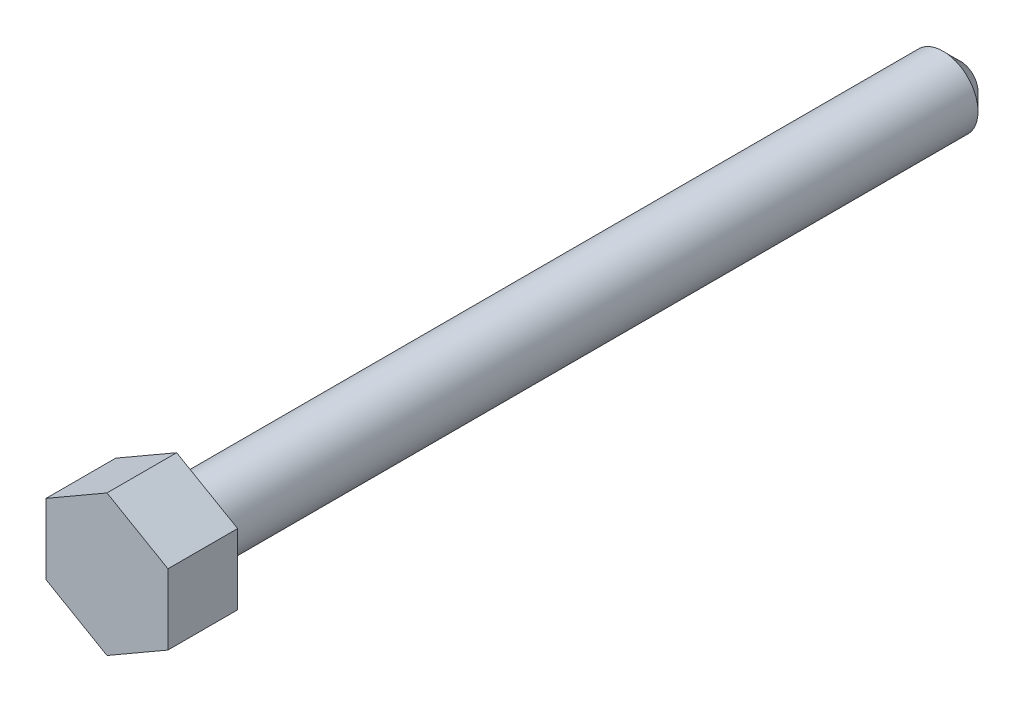
ISO-10303-21;
HEADER;
FILE_DESCRIPTION(('STEP AP214'),'2;1');
FILE_NAME('part.step','',(''),(''),'','','');
FILE_SCHEMA(('AUTOMOTIVE_DESIGN { 1 0 10303 214 1 1 1 1 }'));
ENDSEC;
DATA;
#1=APPLICATION_CONTEXT('core data for automotive mechanical design processes');
#2=APPLICATION_PROTOCOL_DEFINITION('international standard','automotive_design',2000,#1);
#3=PRODUCT_CONTEXT('',#1,'mechanical');
#4=PRODUCT('Part','Part','',(#3));
#5=PRODUCT_RELATED_PRODUCT_CATEGORY('part','',(#4));
#6=PRODUCT_DEFINITION_FORMATION('','',#4);
#7=PRODUCT_DEFINITION_CONTEXT('part definition',#1,'design');
#8=PRODUCT_DEFINITION('design','',#6,#7);
#9=PRODUCT_DEFINITION_SHAPE('','',#8);
#10=(LENGTH_UNIT() NAMED_UNIT(*) SI_UNIT(.MILLI.,.METRE.));
#11=(NAMED_UNIT(*) PLANE_ANGLE_UNIT() SI_UNIT($,.RADIAN.));
#12=(NAMED_UNIT(*) SI_UNIT($,.STERADIAN.) SOLID_ANGLE_UNIT());
#13=UNCERTAINTY_MEASURE_WITH_UNIT(LENGTH_MEASURE(1.E-05),#10,'distance_accuracy_value','');
#14=(GEOMETRIC_REPRESENTATION_CONTEXT(3) GLOBAL_UNCERTAINTY_ASSIGNED_CONTEXT((#13)) GLOBAL_UNIT_ASSIGNED_CONTEXT((#10,
#11,#12)) REPRESENTATION_CONTEXT('',''));
#15=CARTESIAN_POINT('',(0.,0.,0.));
#16=DIRECTION('',(0.,0.,1.));
#17=DIRECTION('',(1.,0.,0.));
#18=AXIS2_PLACEMENT_3D('',#15,#16,#17);
#19=CARTESIAN_POINT('',(0.,0.,45.));
#20=DIRECTION('',(0.,0.,-1.));
#21=DIRECTION('',(-1.,0.,0.));
#22=AXIS2_PLACEMENT_3D('',#19,#20,#21);
#23=CYLINDRICAL_SURFACE('',#22,2.);
#24=CARTESIAN_POINT('',(0.,0.,1.00000000000004));
#25=DIRECTION('',(0.,0.,1.));
#26=DIRECTION('',(1.,0.,0.));
#27=AXIS2_PLACEMENT_3D('',#24,#25,#26);
#28=CIRCLE('',#27,2.);
#29=CARTESIAN_POINT('',(-2.,0.,1.00000000000004));
#30=VERTEX_POINT('',#29);
#31=EDGE_CURVE('E42',#30,#30,#28,.T.);
#32=CARTESIAN_POINT('',(0.,0.,45.));
#33=DIRECTION('',(0.,0.,1.));
#34=DIRECTION('',(1.,0.,0.));
#35=AXIS2_PLACEMENT_3D('',#32,#33,#34);
#36=CIRCLE('',#35,2.);
#37=CARTESIAN_POINT('',(-2.,0.,45.));
#38=VERTEX_POINT('',#37);
#39=EDGE_CURVE('E138',#38,#38,#36,.T.);
#40=CARTESIAN_POINT('',(-2.,0.,1.00000000000004));
#41=CARTESIAN_POINT('',(-2.,0.,1.45833333333337));
#42=CARTESIAN_POINT('',(-2.,0.,1.9166666666667));
#43=CARTESIAN_POINT('',(-2.,0.,2.83333333333337));
#44=CARTESIAN_POINT('',(-2.,0.,3.2916666666667));
#45=CARTESIAN_POINT('',(-2.,0.,4.20833333333337));
#46=CARTESIAN_POINT('',(-2.,0.,4.6666666666667));
#47=CARTESIAN_POINT('',(-2.,0.,5.58333333333337));
#48=CARTESIAN_POINT('',(-2.,0.,6.0416666666667));
#49=CARTESIAN_POINT('',(-2.,0.,6.95833333333337));
#50=CARTESIAN_POINT('',(-2.,0.,7.4166666666667));
#51=CARTESIAN_POINT('',(-2.,0.,8.33333333333336));
#52=CARTESIAN_POINT('',(-2.,0.,8.7916666666667));
#53=CARTESIAN_POINT('',(-2.,0.,9.70833333333336));
#54=CARTESIAN_POINT('',(-2.,0.,10.1666666666667));
#55=CARTESIAN_POINT('',(-2.,0.,11.0833333333334));
#56=CARTESIAN_POINT('',(-2.,0.,11.5416666666667));
#57=CARTESIAN_POINT('',(-2.,0.,12.4583333333334));
#58=CARTESIAN_POINT('',(-2.,0.,12.9166666666667));
#59=CARTESIAN_POINT('',(-2.,0.,13.8333333333334));
#60=CARTESIAN_POINT('',(-2.,0.,14.2916666666667));
#61=CARTESIAN_POINT('',(-2.,0.,15.2083333333334));
#62=CARTESIAN_POINT('',(-2.,0.,15.6666666666667));
#63=CARTESIAN_POINT('',(-2.,0.,16.5833333333334));
#64=CARTESIAN_POINT('',(-2.,0.,17.0416666666667));
#65=CARTESIAN_POINT('',(-2.,0.,17.9583333333333));
#66=CARTESIAN_POINT('',(-2.,0.,18.4166666666667));
#67=CARTESIAN_POINT('',(-2.,0.,19.3333333333333));
#68=CARTESIAN_POINT('',(-2.,0.,19.7916666666667));
#69=CARTESIAN_POINT('',(-2.,0.,20.7083333333333));
#70=CARTESIAN_POINT('',(-2.,0.,21.1666666666667));
#71=CARTESIAN_POINT('',(-2.,0.,22.0833333333333));
#72=CARTESIAN_POINT('',(-2.,0.,22.5416666666667));
#73=CARTESIAN_POINT('',(-2.,0.,23.4583333333333));
#74=CARTESIAN_POINT('',(-2.,0.,23.9166666666667));
#75=CARTESIAN_POINT('',(-2.,0.,24.8333333333333));
#76=CARTESIAN_POINT('',(-2.,0.,25.2916666666667));
#77=CARTESIAN_POINT('',(-2.,0.,26.2083333333333));
#78=CARTESIAN_POINT('',(-2.,0.,26.6666666666667));
#79=CARTESIAN_POINT('',(-2.,0.,27.5833333333333));
#80=CARTESIAN_POINT('',(-2.,0.,28.0416666666667));
#81=CARTESIAN_POINT('',(-2.,0.,28.9583333333333));
#82=CARTESIAN_POINT('',(-2.,0.,29.4166666666667));
#83=CARTESIAN_POINT('',(-2.,0.,30.3333333333333));
#84=CARTESIAN_POINT('',(-2.,0.,30.7916666666667));
#85=CARTESIAN_POINT('',(-2.,0.,31.7083333333333));
#86=CARTESIAN_POINT('',(-2.,0.,32.1666666666667));
#87=CARTESIAN_POINT('',(-2.,0.,33.0833333333333));
#88=CARTESIAN_POINT('',(-2.,0.,33.5416666666667));
#89=CARTESIAN_POINT('',(-2.,0.,34.4583333333333));
#90=CARTESIAN_POINT('',(-2.,0.,34.9166666666667));
#91=CARTESIAN_POINT('',(-2.,0.,35.8333333333333));
#92=CARTESIAN_POINT('',(-2.,0.,36.2916666666667));
#93=CARTESIAN_POINT('',(-2.,0.,37.2083333333333));
#94=CARTESIAN_POINT('',(-2.,0.,37.6666666666667));
#95=CARTESIAN_POINT('',(-2.,0.,38.5833333333333));
#96=CARTESIAN_POINT('',(-2.,0.,39.0416666666667));
#97=CARTESIAN_POINT('',(-2.,0.,39.9583333333333));
#98=CARTESIAN_POINT('',(-2.,0.,40.4166666666667));
#99=CARTESIAN_POINT('',(-2.,0.,41.3333333333333));
#100=CARTESIAN_POINT('',(-2.,0.,41.7916666666667));
#101=CARTESIAN_POINT('',(-2.,0.,42.7083333333333));
#102=CARTESIAN_POINT('',(-2.,0.,43.1666666666667));
#103=CARTESIAN_POINT('',(-2.,0.,44.0833333333333));
#104=CARTESIAN_POINT('',(-2.,0.,44.5416666666667));
#105=CARTESIAN_POINT('',(-2.,0.,45.));
#106=B_SPLINE_CURVE_WITH_KNOTS('',3,(#40,#41,#42,#43,#44,#45,#46,#47,#48,#49,#50,#51,#52,#53,
#54,#55,#56,#57,#58,#59,#60,#61,#62,#63,#64,#65,#66,#67,#68,#69,#70,#71,#72,#73,#74,#75,#76,#77,
#78,#79,#80,#81,#82,#83,#84,#85,#86,#87,#88,#89,#90,#91,#92,#93,#94,#95,#96,#97,#98,#99,#100,
#101,#102,#103,#104,#105),.UNSPECIFIED.,.F.,.F.,(4,2,2,2,2,2,2,2,2,2,2,2,2,2,2,2,2,2,2,2,2,2,2,
2,2,2,2,2,2,2,2,2,4),(0.,1.375,2.75,4.125,5.5,6.87499999999999,8.24999999999999,
9.62499999999999,11.,12.375,13.75,15.125,16.5,17.875,19.25,20.625,22.,23.375,24.75,26.125,27.5,
28.875,30.25,31.625,33.,34.375,35.75,37.125,38.5,39.875,41.25,42.625,44.),.UNSPECIFIED.);
#107=EDGE_CURVE('BSEAM33',#30,#38,#106,.T.);
#108=ORIENTED_EDGE('',*,*,#31,.T.);
#109=ORIENTED_EDGE('',*,*,#39,.F.);
#110=ORIENTED_EDGE('',*,*,#107,.T.);
#111=ORIENTED_EDGE('',*,*,#107,.F.);
#112=EDGE_LOOP('',(#108,#110,#109,#111));
#113=FACE_BOUND('',#112,.T.);
#114=ADVANCED_FACE('F33',(#113),#23,.T.);
#115=CARTESIAN_POINT('',(0.,0.,0.));
#116=DIRECTION('',(0.,0.,1.));
#117=DIRECTION('',(1.,0.,0.));
#118=AXIS2_PLACEMENT_3D('',#115,#116,#117);
#119=PLANE('',#118);
#120=CARTESIAN_POINT('',(0.,0.,0.));
#121=DIRECTION('',(0.,0.,1.));
#122=DIRECTION('',(1.,0.,0.));
#123=AXIS2_PLACEMENT_3D('',#120,#121,#122);
#124=CIRCLE('',#123,0.999999999999952);
#125=CARTESIAN_POINT('',(0.999999999999952,0.,0.));
#126=VERTEX_POINT('',#125);
#127=EDGE_CURVE('E11',#126,#126,#124,.F.);
#128=ORIENTED_EDGE('',*,*,#127,.T.);
#129=EDGE_LOOP('',(#128));
#130=FACE_BOUND('',#129,.T.);
#131=ADVANCED_FACE('F155',(#130),#119,.F.);
#132=CARTESIAN_POINT('',(3.5,2.02072594216369,49.));
#133=DIRECTION('',(-0.5,-0.866025403784439,0.));
#134=DIRECTION('',(0.866025403784439,-0.5,0.));
#135=AXIS2_PLACEMENT_3D('',#132,#133,#134);
#136=PLANE('',#135);
#137=DIRECTION('',(-0.866025403784439,0.5,0.));
#138=VECTOR('',#137,1.);
#139=CARTESIAN_POINT('',(3.5,2.02072594216369,45.));
#140=LINE('',#139,#138);
#141=CARTESIAN_POINT('',(3.5,2.02072594216369,45.));
#142=VERTEX_POINT('',#141);
#143=CARTESIAN_POINT('',(0.,4.04145188432738,45.));
#144=VERTEX_POINT('',#143);
#145=EDGE_CURVE('E119',#142,#144,#140,.T.);
#146=ORIENTED_EDGE('',*,*,#145,.T.);
#147=DIRECTION('',(0.,0.,-1.));
#148=VECTOR('',#147,1.);
#149=CARTESIAN_POINT('',(0.,4.04145188432738,49.));
#150=LINE('',#149,#148);
#151=CARTESIAN_POINT('',(0.,4.04145188432738,49.));
#152=VERTEX_POINT('',#151);
#153=EDGE_CURVE('E136',#152,#144,#150,.T.);
#154=ORIENTED_EDGE('',*,*,#153,.F.);
#155=DIRECTION('',(-0.866025403784439,0.5,0.));
#156=VECTOR('',#155,1.);
#157=CARTESIAN_POINT('',(3.5,2.02072594216369,49.));
#158=LINE('',#157,#156);
#159=CARTESIAN_POINT('',(3.5,2.02072594216369,49.));
#160=VERTEX_POINT('',#159);
#161=EDGE_CURVE('E129',#160,#152,#158,.T.);
#162=ORIENTED_EDGE('',*,*,#161,.F.);
#163=DIRECTION('',(0.,0.,-1.));
#164=VECTOR('',#163,1.);
#165=CARTESIAN_POINT('',(3.5,2.02072594216369,49.));
#166=LINE('',#165,#164);
#167=EDGE_CURVE('E115',#160,#142,#166,.T.);
#168=ORIENTED_EDGE('',*,*,#167,.T.);
#169=EDGE_LOOP('',(#146,#154,#162,#168));
#170=FACE_BOUND('',#169,.T.);
#171=ADVANCED_FACE('F160',(#170),#136,.F.);
#172=CARTESIAN_POINT('',(0.,4.04145188432738,49.));
#173=DIRECTION('',(0.5,-0.866025403784439,0.));
#174=DIRECTION('',(0.866025403784439,0.5,0.));
#175=AXIS2_PLACEMENT_3D('',#172,#173,#174);
#176=PLANE('',#175);
#177=DIRECTION('',(-0.866025403784439,-0.5,0.));
#178=VECTOR('',#177,1.);
#179=CARTESIAN_POINT('',(0.,4.04145188432738,45.));
#180=LINE('',#179,#178);
#181=CARTESIAN_POINT('',(-3.5,2.02072594216369,45.));
#182=VERTEX_POINT('',#181);
#183=EDGE_CURVE('E122',#144,#182,#180,.T.);
#184=ORIENTED_EDGE('',*,*,#183,.T.);
#185=DIRECTION('',(0.,0.,-1.));
#186=VECTOR('',#185,1.);
#187=CARTESIAN_POINT('',(-3.5,2.02072594216369,49.));
#188=LINE('',#187,#186);
#189=CARTESIAN_POINT('',(-3.5,2.02072594216369,49.));
#190=VERTEX_POINT('',#189);
#191=EDGE_CURVE('E133',#190,#182,#188,.T.);
#192=ORIENTED_EDGE('',*,*,#191,.F.);
#193=DIRECTION('',(-0.866025403784439,-0.5,0.));
#194=VECTOR('',#193,1.);
#195=CARTESIAN_POINT('',(0.,4.04145188432738,49.));
#196=LINE('',#195,#194);
#197=EDGE_CURVE('E88',#152,#190,#196,.T.);
#198=ORIENTED_EDGE('',*,*,#197,.F.);
#199=ORIENTED_EDGE('',*,*,#153,.T.);
#200=EDGE_LOOP('',(#184,#192,#198,#199));
#201=FACE_BOUND('',#200,.T.);
#202=ADVANCED_FACE('F166',(#201),#176,.F.);
#203=CARTESIAN_POINT('',(-3.5,2.02072594216369,49.));
#204=DIRECTION('',(1.,0.,0.));
#205=DIRECTION('',(0.,1.,0.));
#206=AXIS2_PLACEMENT_3D('',#203,#204,#205);
#207=PLANE('',#206);
#208=DIRECTION('',(0.,-1.,0.));
#209=VECTOR('',#208,1.);
#210=CARTESIAN_POINT('',(-3.5,2.02072594216369,45.));
#211=LINE('',#210,#209);
#212=CARTESIAN_POINT('',(-3.5,-2.02072594216369,45.));
#213=VERTEX_POINT('',#212);
#214=EDGE_CURVE('E124',#182,#213,#211,.T.);
#215=ORIENTED_EDGE('',*,*,#214,.T.);
#216=DIRECTION('',(0.,0.,-1.));
#217=VECTOR('',#216,1.);
#218=CARTESIAN_POINT('',(-3.5,-2.02072594216369,49.));
#219=LINE('',#218,#217);
#220=CARTESIAN_POINT('',(-3.5,-2.02072594216369,49.));
#221=VERTEX_POINT('',#220);
#222=EDGE_CURVE('E110',#221,#213,#219,.T.);
#223=ORIENTED_EDGE('',*,*,#222,.F.);
#224=DIRECTION('',(0.,-1.,0.));
#225=VECTOR('',#224,1.);
#226=CARTESIAN_POINT('',(-3.5,2.02072594216369,49.));
#227=LINE('',#226,#225);
#228=EDGE_CURVE('E101',#190,#221,#227,.T.);
#229=ORIENTED_EDGE('',*,*,#228,.F.);
#230=ORIENTED_EDGE('',*,*,#191,.T.);
#231=EDGE_LOOP('',(#215,#223,#229,#230));
#232=FACE_BOUND('',#231,.T.);
#233=ADVANCED_FACE('F170',(#232),#207,.F.);
#234=CARTESIAN_POINT('',(-3.5,-2.02072594216369,49.));
#235=DIRECTION('',(0.5,0.866025403784439,0.));
#236=DIRECTION('',(-0.866025403784439,0.5,0.));
#237=AXIS2_PLACEMENT_3D('',#234,#235,#236);
#238=PLANE('',#237);
#239=DIRECTION('',(0.866025403784439,-0.5,0.));
#240=VECTOR('',#239,1.);
#241=CARTESIAN_POINT('',(-3.5,-2.02072594216369,45.));
#242=LINE('',#241,#240);
#243=CARTESIAN_POINT('',(0.,-4.04145188432738,45.));
#244=VERTEX_POINT('',#243);
#245=EDGE_CURVE('E109',#213,#244,#242,.T.);
#246=ORIENTED_EDGE('',*,*,#245,.T.);
#247=DIRECTION('',(0.,0.,-1.));
#248=VECTOR('',#247,1.);
#249=CARTESIAN_POINT('',(0.,-4.04145188432738,49.));
#250=LINE('',#249,#248);
#251=CARTESIAN_POINT('',(0.,-4.04145188432738,49.));
#252=VERTEX_POINT('',#251);
#253=EDGE_CURVE('E106',#252,#244,#250,.T.);
#254=ORIENTED_EDGE('',*,*,#253,.F.);
#255=DIRECTION('',(0.866025403784439,-0.5,0.));
#256=VECTOR('',#255,1.);
#257=CARTESIAN_POINT('',(-3.5,-2.02072594216369,49.));
#258=LINE('',#257,#256);
#259=EDGE_CURVE('E95',#221,#252,#258,.T.);
#260=ORIENTED_EDGE('',*,*,#259,.F.);
#261=ORIENTED_EDGE('',*,*,#222,.T.);
#262=EDGE_LOOP('',(#246,#254,#260,#261));
#263=FACE_BOUND('',#262,.T.);
#264=ADVANCED_FACE('F107',(#263),#238,.F.);
#265=CARTESIAN_POINT('',(0.,-4.04145188432738,49.));
#266=DIRECTION('',(-0.5,0.866025403784439,0.));
#267=DIRECTION('',(-0.866025403784439,-0.5,0.));
#268=AXIS2_PLACEMENT_3D('',#265,#266,#267);
#269=PLANE('',#268);
#270=DIRECTION('',(0.866025403784439,0.5,0.));
#271=VECTOR('',#270,1.);
#272=CARTESIAN_POINT('',(0.,-4.04145188432738,45.));
#273=LINE('',#272,#271);
#274=CARTESIAN_POINT('',(3.5,-2.02072594216369,45.));
#275=VERTEX_POINT('',#274);
#276=EDGE_CURVE('E73',#244,#275,#273,.T.);
#277=ORIENTED_EDGE('',*,*,#276,.T.);
#278=DIRECTION('',(0.,0.,-1.));
#279=VECTOR('',#278,1.);
#280=CARTESIAN_POINT('',(3.5,-2.02072594216369,49.));
#281=LINE('',#280,#279);
#282=CARTESIAN_POINT('',(3.5,-2.02072594216369,49.));
#283=VERTEX_POINT('',#282);
#284=EDGE_CURVE('E111',#283,#275,#281,.T.);
#285=ORIENTED_EDGE('',*,*,#284,.F.);
#286=DIRECTION('',(0.866025403784439,0.5,0.));
#287=VECTOR('',#286,1.);
#288=CARTESIAN_POINT('',(0.,-4.04145188432738,49.));
#289=LINE('',#288,#287);
#290=EDGE_CURVE('E99',#252,#283,#289,.T.);
#291=ORIENTED_EDGE('',*,*,#290,.F.);
#292=ORIENTED_EDGE('',*,*,#253,.T.);
#293=EDGE_LOOP('',(#277,#285,#291,#292));
#294=FACE_BOUND('',#293,.T.);
#295=ADVANCED_FACE('F113',(#294),#269,.F.);
#296=CARTESIAN_POINT('',(3.5,-2.02072594216369,49.));
#297=DIRECTION('',(-1.,0.,0.));
#298=DIRECTION('',(0.,-1.,0.));
#299=AXIS2_PLACEMENT_3D('',#296,#297,#298);
#300=PLANE('',#299);
#301=DIRECTION('',(0.,1.,0.));
#302=VECTOR('',#301,1.);
#303=CARTESIAN_POINT('',(3.5,-2.02072594216369,45.));
#304=LINE('',#303,#302);
#305=EDGE_CURVE('E79',#275,#142,#304,.T.);
#306=ORIENTED_EDGE('',*,*,#305,.T.);
#307=ORIENTED_EDGE('',*,*,#167,.F.);
#308=DIRECTION('',(0.,1.,0.));
#309=VECTOR('',#308,1.);
#310=CARTESIAN_POINT('',(3.5,-2.02072594216369,49.));
#311=LINE('',#310,#309);
#312=EDGE_CURVE('E50',#283,#160,#311,.T.);
#313=ORIENTED_EDGE('',*,*,#312,.F.);
#314=ORIENTED_EDGE('',*,*,#284,.T.);
#315=EDGE_LOOP('',(#306,#307,#313,#314));
#316=FACE_BOUND('',#315,.T.);
#317=ADVANCED_FACE('F178',(#316),#300,.F.);
#318=CARTESIAN_POINT('',(0.,0.,49.));
#319=DIRECTION('',(0.,0.,1.));
#320=DIRECTION('',(1.,0.,0.));
#321=AXIS2_PLACEMENT_3D('',#318,#319,#320);
#322=PLANE('',#321);
#323=ORIENTED_EDGE('',*,*,#161,.T.);
#324=ORIENTED_EDGE('',*,*,#197,.T.);
#325=ORIENTED_EDGE('',*,*,#228,.T.);
#326=ORIENTED_EDGE('',*,*,#259,.T.);
#327=ORIENTED_EDGE('',*,*,#290,.T.);
#328=ORIENTED_EDGE('',*,*,#312,.T.);
#329=EDGE_LOOP('',(#323,#324,#325,#326,#327,#328));
#330=FACE_BOUND('',#329,.T.);
#331=ADVANCED_FACE('F97',(#330),#322,.T.);
#332=CARTESIAN_POINT('',(0.,0.,45.));
#333=DIRECTION('',(0.,0.,1.));
#334=DIRECTION('',(1.,0.,0.));
#335=AXIS2_PLACEMENT_3D('',#332,#333,#334);
#336=PLANE('',#335);
#337=ORIENTED_EDGE('',*,*,#39,.T.);
#338=EDGE_LOOP('',(#337));
#339=FACE_BOUND('',#338,.T.);
#340=ORIENTED_EDGE('',*,*,#145,.F.);
#341=ORIENTED_EDGE('',*,*,#305,.F.);
#342=ORIENTED_EDGE('',*,*,#276,.F.);
#343=ORIENTED_EDGE('',*,*,#245,.F.);
#344=ORIENTED_EDGE('',*,*,#214,.F.);
#345=ORIENTED_EDGE('',*,*,#183,.F.);
#346=EDGE_LOOP('',(#340,#341,#342,#343,#344,#345));
#347=FACE_BOUND('',#346,.T.);
#348=ADVANCED_FACE('F146',(#339,#347),#336,.F.);
#349=CARTESIAN_POINT('',(0.,0.,1.00000000000004));
#350=DIRECTION('',(0.,0.,1.));
#351=DIRECTION('',(1.,0.,0.));
#352=AXIS2_PLACEMENT_3D('',#349,#350,#351);
#353=CONICAL_SURFACE('',#352,2.,0.785398163397454);
#354=ORIENTED_EDGE('',*,*,#127,.F.);
#355=EDGE_LOOP('',(#354));
#356=FACE_BOUND('',#355,.T.);
#357=ORIENTED_EDGE('',*,*,#31,.F.);
#358=EDGE_LOOP('',(#357));
#359=FACE_BOUND('',#358,.T.);
#360=ADVANCED_FACE('F35',(#356,#359),#353,.T.);
#361=CLOSED_SHELL('',(#114,#131,#171,#202,#233,#264,#295,#317,#331,#348,#360));
#362=MANIFOLD_SOLID_BREP('B2',#361);
#363=ADVANCED_BREP_SHAPE_REPRESENTATION('',(#18,#362),#14);
#364=SHAPE_DEFINITION_REPRESENTATION(#9,#363);
ENDSEC;
END-ISO-10303-21;
